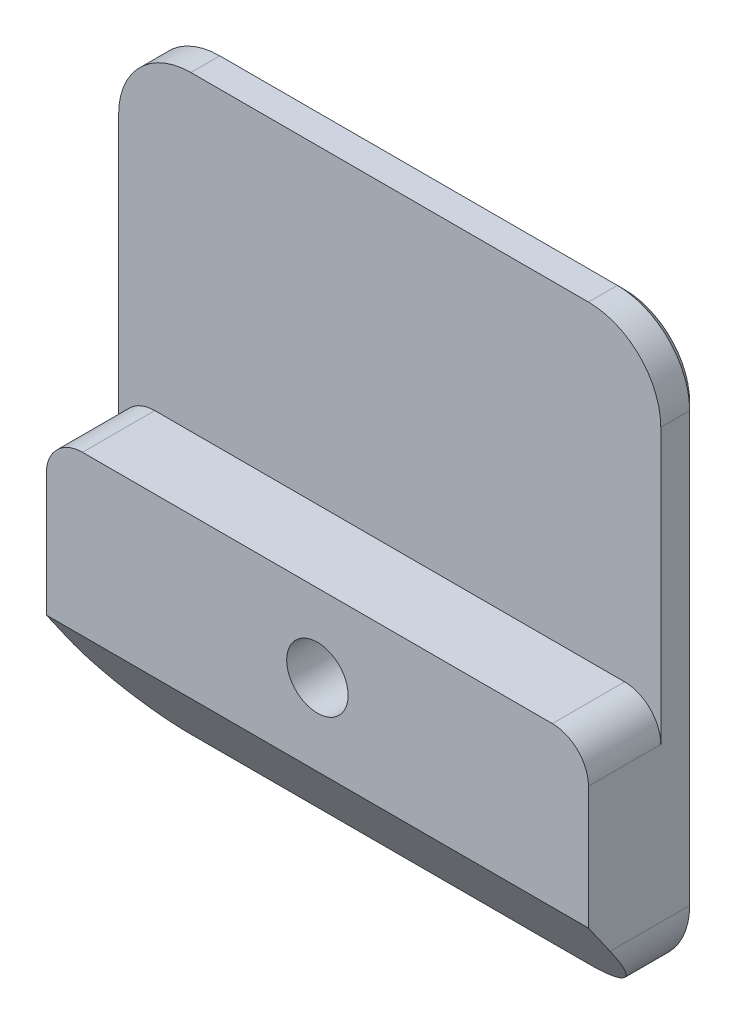
ISO-10303-21;
HEADER;
FILE_DESCRIPTION(('STEP AP214'),'2;1');
FILE_NAME('part.step','',(''),(''),'','','');
FILE_SCHEMA(('AUTOMOTIVE_DESIGN { 1 0 10303 214 1 1 1 1 }'));
ENDSEC;
DATA;
#1=APPLICATION_CONTEXT('core data for automotive mechanical design processes');
#2=APPLICATION_PROTOCOL_DEFINITION('international standard','automotive_design',2000,#1);
#3=PRODUCT_CONTEXT('',#1,'mechanical');
#4=PRODUCT('Part','Part','',(#3));
#5=PRODUCT_RELATED_PRODUCT_CATEGORY('part','',(#4));
#6=PRODUCT_DEFINITION_FORMATION('','',#4);
#7=PRODUCT_DEFINITION_CONTEXT('part definition',#1,'design');
#8=PRODUCT_DEFINITION('design','',#6,#7);
#9=PRODUCT_DEFINITION_SHAPE('','',#8);
#10=(LENGTH_UNIT() NAMED_UNIT(*) SI_UNIT(.MILLI.,.METRE.));
#11=(NAMED_UNIT(*) PLANE_ANGLE_UNIT() SI_UNIT($,.RADIAN.));
#12=(NAMED_UNIT(*) SI_UNIT($,.STERADIAN.) SOLID_ANGLE_UNIT());
#13=UNCERTAINTY_MEASURE_WITH_UNIT(LENGTH_MEASURE(1.E-05),#10,'distance_accuracy_value','');
#14=(GEOMETRIC_REPRESENTATION_CONTEXT(3) GLOBAL_UNCERTAINTY_ASSIGNED_CONTEXT((#13)) GLOBAL_UNIT_ASSIGNED_CONTEXT((#10,
#11,#12)) REPRESENTATION_CONTEXT('',''));
#15=CARTESIAN_POINT('',(0.,0.,0.));
#16=DIRECTION('',(0.,0.,1.));
#17=DIRECTION('',(1.,0.,0.));
#18=AXIS2_PLACEMENT_3D('',#15,#16,#17);
#19=CARTESIAN_POINT('',(127.000000000024,144.499999642365,-120.096120019362));
#20=DIRECTION('',(0.,0.,-1.));
#21=DIRECTION('',(0.,-1.,0.));
#22=AXIS2_PLACEMENT_3D('',#19,#20,#21);
#23=PLANE('',#22);
#24=CARTESIAN_POINT('',(17.5000805501884,-22.4999238370435,-120.096120019362));
#25=DIRECTION('',(0.,0.,-1.));
#26=DIRECTION('',(1.,0.,0.));
#27=AXIS2_PLACEMENT_3D('',#24,#25,#26);
#28=CIRCLE('',#27,1.7);
#29=CARTESIAN_POINT('',(15.8000805501884,-22.4999238370435,-120.096120019362));
#30=VERTEX_POINT('',#29);
#31=EDGE_CURVE('E314',#30,#30,#28,.T.);
#32=ORIENTED_EDGE('',*,*,#31,.T.);
#33=EDGE_LOOP('',(#32));
#34=FACE_BOUND('',#33,.T.);
#35=CARTESIAN_POINT('',(4.5000805501884,-20.1999243138907,-120.096120019362));
#36=DIRECTION('',(0.,0.,-1.));
#37=DIRECTION('',(-0.707106781186547,0.707106781186548,0.));
#38=AXIS2_PLACEMENT_3D('',#35,#36,#37);
#39=CIRCLE('',#38,2.);
#40=CARTESIAN_POINT('',(2.50008055018839,-20.1999243138907,-120.096120019362));
#41=VERTEX_POINT('',#40);
#42=CARTESIAN_POINT('',(4.50008055018838,-18.1999243138907,-120.096120019362));
#43=VERTEX_POINT('',#42);
#44=EDGE_CURVE('E216',#41,#43,#39,.T.);
#45=ORIENTED_EDGE('',*,*,#44,.F.);
#46=DIRECTION('',(0.,1.,0.));
#47=VECTOR('',#46,1.);
#48=CARTESIAN_POINT('',(2.50008055018839,55.8937418891761,-120.096120019362));
#49=LINE('',#48,#47);
#50=CARTESIAN_POINT('',(2.5000805501884,-26.9999238370439,-120.096113854182));
#51=VERTEX_POINT('',#50);
#52=EDGE_CURVE('E222',#51,#41,#49,.T.);
#53=ORIENTED_EDGE('',*,*,#52,.F.);
#54=DIRECTION('',(1.,0.,0.));
#55=VECTOR('',#54,1.);
#56=CARTESIAN_POINT('',(97.2500402751087,-26.9999326418315,-120.096120019362));
#57=LINE('',#56,#55);
#58=CARTESIAN_POINT('',(32.5000805501884,-26.9999238370432,-120.096113854182));
#59=VERTEX_POINT('',#58);
#60=EDGE_CURVE('E220',#51,#59,#57,.T.);
#61=ORIENTED_EDGE('',*,*,#60,.T.);
#62=DIRECTION('',(0.,-1.,0.));
#63=VECTOR('',#62,1.);
#64=CARTESIAN_POINT('',(32.5000805501884,71.7499574538275,-120.096120019362));
#65=LINE('',#64,#63);
#66=CARTESIAN_POINT('',(32.5000805501884,-20.1999243138907,-120.096120019362));
#67=VERTEX_POINT('',#66);
#68=EDGE_CURVE('E205',#67,#59,#65,.T.);
#69=ORIENTED_EDGE('',*,*,#68,.F.);
#70=CARTESIAN_POINT('',(30.5000805501884,-20.1999243138907,-120.096120019362));
#71=DIRECTION('',(0.,0.,-1.));
#72=DIRECTION('',(0.707106781186549,0.707106781186546,0.));
#73=AXIS2_PLACEMENT_3D('',#70,#71,#72);
#74=CIRCLE('',#73,2.);
#75=CARTESIAN_POINT('',(30.5000805501884,-18.1999243138907,-120.096120019362));
#76=VERTEX_POINT('',#75);
#77=EDGE_CURVE('E181',#76,#67,#74,.T.);
#78=ORIENTED_EDGE('',*,*,#77,.F.);
#79=DIRECTION('',(-1.,0.,0.));
#80=VECTOR('',#79,1.);
#81=CARTESIAN_POINT('',(219.500000000024,-18.1999243138907,-120.096120019362));
#82=LINE('',#81,#80);
#83=EDGE_CURVE('E319',#76,#43,#82,.T.);
#84=ORIENTED_EDGE('',*,*,#83,.T.);
#85=EDGE_LOOP('',(#45,#53,#61,#69,#78,#84));
#86=FACE_BOUND('',#85,.T.);
#87=ADVANCED_FACE('F17',(#34,#86),#23,.F.);
#88=CARTESIAN_POINT('',(28.5000805501884,-5.00008473471028,-124.09611364809));
#89=DIRECTION('',(0.,0.,-1.));
#90=DIRECTION('',(0.707106781186548,0.707106781186547,0.));
#91=AXIS2_PLACEMENT_3D('',#88,#89,#90);
#92=CYLINDRICAL_SURFACE('',#91,4.);
#93=CARTESIAN_POINT('',(28.5000805501884,-5.00008473471028,-125.69611364809));
#94=DIRECTION('',(0.,0.,-1.));
#95=DIRECTION('',(0.707106781186548,0.707106781186547,0.));
#96=AXIS2_PLACEMENT_3D('',#93,#94,#95);
#97=CIRCLE('',#96,4.);
#98=CARTESIAN_POINT('',(28.5000805501884,-1.00008473471028,-125.69611364809));
#99=VERTEX_POINT('',#98);
#100=CARTESIAN_POINT('',(32.5000805501884,-5.00008473471028,-125.69611364809));
#101=VERTEX_POINT('',#100);
#102=EDGE_CURVE('E285',#99,#101,#97,.T.);
#103=ORIENTED_EDGE('',*,*,#102,.F.);
#104=DIRECTION('',(0.,0.,1.));
#105=VECTOR('',#104,1.);
#106=CARTESIAN_POINT('',(28.5000805501884,-1.00008473471028,-124.09611364809));
#107=LINE('',#106,#105);
#108=CARTESIAN_POINT('',(28.5000805501884,-1.00008473471028,-124.09611385418));
#109=VERTEX_POINT('',#108);
#110=EDGE_CURVE('E28',#99,#109,#107,.T.);
#111=ORIENTED_EDGE('',*,*,#110,.T.);
#112=CARTESIAN_POINT('',(28.5000805501884,-5.00008473471028,-124.09611385418));
#113=DIRECTION('',(0.,0.,-1.));
#114=DIRECTION('',(0.707106781186548,0.707106781186547,0.));
#115=AXIS2_PLACEMENT_3D('',#112,#113,#114);
#116=CIRCLE('',#115,4.);
#117=CARTESIAN_POINT('',(32.5000805501884,-5.00008473471029,-124.09611385418));
#118=VERTEX_POINT('',#117);
#119=EDGE_CURVE('E11',#109,#118,#116,.T.);
#120=ORIENTED_EDGE('',*,*,#119,.T.);
#121=DIRECTION('',(0.,0.,-1.));
#122=VECTOR('',#121,1.);
#123=CARTESIAN_POINT('',(32.5000805501884,-5.00008473471028,-124.09611364809));
#124=LINE('',#123,#122);
#125=EDGE_CURVE('E291',#118,#101,#124,.T.);
#126=ORIENTED_EDGE('',*,*,#125,.T.);
#127=EDGE_LOOP('',(#103,#111,#120,#126));
#128=FACE_BOUND('',#127,.T.);
#129=ADVANCED_FACE('F534',(#128),#92,.T.);
#130=CARTESIAN_POINT('',(127.000000000024,166.999999999986,-124.09611385418));
#131=DIRECTION('',(0.,0.,-1.));
#132=DIRECTION('',(0.,-1.,0.));
#133=AXIS2_PLACEMENT_3D('',#130,#131,#132);
#134=PLANE('',#133);
#135=DIRECTION('',(0.,-1.,0.));
#136=VECTOR('',#135,1.);
#137=CARTESIAN_POINT('',(32.5000805501884,82.9999576326379,-124.09611385418));
#138=LINE('',#137,#136);
#139=CARTESIAN_POINT('',(32.5000805501884,-20.1999243138907,-124.09611385418));
#140=VERTEX_POINT('',#139);
#141=EDGE_CURVE('E294',#118,#140,#138,.T.);
#142=ORIENTED_EDGE('',*,*,#141,.F.);
#143=ORIENTED_EDGE('',*,*,#119,.F.);
#144=DIRECTION('',(1.,0.,0.));
#145=VECTOR('',#144,1.);
#146=CARTESIAN_POINT('',(64.7500402751065,-1.00008473471027,-124.09611385418));
#147=LINE('',#146,#145);
#148=CARTESIAN_POINT('',(6.5000805501884,-1.00008473471028,-124.09611385418));
#149=VERTEX_POINT('',#148);
#150=EDGE_CURVE('E373',#149,#109,#147,.T.);
#151=ORIENTED_EDGE('',*,*,#150,.F.);
#152=CARTESIAN_POINT('',(6.5000805501884,-5.00008473471029,-124.09611385418));
#153=DIRECTION('',(0.,0.,-1.));
#154=DIRECTION('',(-0.707106781186548,0.707106781186548,0.));
#155=AXIS2_PLACEMENT_3D('',#152,#153,#154);
#156=CIRCLE('',#155,4.);
#157=CARTESIAN_POINT('',(2.50008055018839,-5.00008473471029,-124.09611385418));
#158=VERTEX_POINT('',#157);
#159=EDGE_CURVE('E318',#158,#149,#156,.T.);
#160=ORIENTED_EDGE('',*,*,#159,.F.);
#161=DIRECTION('',(0.,1.,0.));
#162=VECTOR('',#161,1.);
#163=CARTESIAN_POINT('',(2.50008055018839,67.1437420679865,-124.09611385418));
#164=LINE('',#163,#162);
#165=CARTESIAN_POINT('',(2.5000805501884,-20.1999243138907,-124.09611385418));
#166=VERTEX_POINT('',#165);
#167=EDGE_CURVE('E278',#166,#158,#164,.T.);
#168=ORIENTED_EDGE('',*,*,#167,.F.);
#169=CARTESIAN_POINT('',(4.5000805501884,-20.1999243138907,-124.09611385418));
#170=DIRECTION('',(0.,0.,1.));
#171=DIRECTION('',(-0.707106781186547,0.707106781186548,0.));
#172=AXIS2_PLACEMENT_3D('',#169,#170,#171);
#173=CIRCLE('',#172,2.);
#174=CARTESIAN_POINT('',(4.50008055018838,-18.1999243138907,-124.09611385418));
#175=VERTEX_POINT('',#174);
#176=EDGE_CURVE('E324',#175,#166,#173,.T.);
#177=ORIENTED_EDGE('',*,*,#176,.F.);
#178=DIRECTION('',(-1.,0.,0.));
#179=VECTOR('',#178,1.);
#180=CARTESIAN_POINT('',(219.500000000024,-18.1999243138907,-124.09611385418));
#181=LINE('',#180,#179);
#182=CARTESIAN_POINT('',(30.5000805501884,-18.1999243138907,-124.09611385418));
#183=VERTEX_POINT('',#182);
#184=EDGE_CURVE('E315',#183,#175,#181,.T.);
#185=ORIENTED_EDGE('',*,*,#184,.F.);
#186=CARTESIAN_POINT('',(30.5000805501884,-20.1999243138907,-124.09611385418));
#187=DIRECTION('',(0.,0.,1.));
#188=DIRECTION('',(0.707106781186549,0.707106781186546,0.));
#189=AXIS2_PLACEMENT_3D('',#186,#187,#188);
#190=CIRCLE('',#189,2.);
#191=EDGE_CURVE('E170',#140,#183,#190,.T.);
#192=ORIENTED_EDGE('',*,*,#191,.F.);
#193=EDGE_LOOP('',(#142,#143,#151,#160,#168,#177,#185,#192));
#194=FACE_BOUND('',#193,.T.);
#195=ADVANCED_FACE('F526',(#194),#134,.F.);
#196=CARTESIAN_POINT('',(2.5000805501884,-1.00008473471029,-124.09611364809));
#197=DIRECTION('',(0.,1.,0.));
#198=DIRECTION('',(1.,0.,0.));
#199=AXIS2_PLACEMENT_3D('',#196,#197,#198);
#200=PLANE('',#199);
#201=DIRECTION('',(1.,0.,0.));
#202=VECTOR('',#201,1.);
#203=CARTESIAN_POINT('',(64.7500402751065,-1.00008473471027,-125.69611364809));
#204=LINE('',#203,#202);
#205=CARTESIAN_POINT('',(6.5000805501884,-1.00008473471029,-125.69611364809));
#206=VERTEX_POINT('',#205);
#207=EDGE_CURVE('E303',#206,#99,#204,.T.);
#208=ORIENTED_EDGE('',*,*,#207,.F.);
#209=DIRECTION('',(0.,0.,-1.));
#210=VECTOR('',#209,1.);
#211=CARTESIAN_POINT('',(6.5000805501884,-1.00008473471029,-124.09611364809));
#212=LINE('',#211,#210);
#213=EDGE_CURVE('E426',#149,#206,#212,.T.);
#214=ORIENTED_EDGE('',*,*,#213,.F.);
#215=ORIENTED_EDGE('',*,*,#150,.T.);
#216=ORIENTED_EDGE('',*,*,#110,.F.);
#217=EDGE_LOOP('',(#208,#214,#215,#216));
#218=FACE_BOUND('',#217,.T.);
#219=ADVANCED_FACE('F483',(#218),#200,.T.);
#220=CARTESIAN_POINT('',(6.5000805501884,-5.00008473471029,-124.09611364809));
#221=DIRECTION('',(0.,0.,-1.));
#222=DIRECTION('',(-0.707106781186548,0.707106781186548,0.));
#223=AXIS2_PLACEMENT_3D('',#220,#221,#222);
#224=CYLINDRICAL_SURFACE('',#223,4.);
#225=CARTESIAN_POINT('',(6.5000805501884,-5.00008473471029,-125.69611364809));
#226=DIRECTION('',(0.,0.,-1.));
#227=DIRECTION('',(-0.707106781186548,0.707106781186548,0.));
#228=AXIS2_PLACEMENT_3D('',#225,#226,#227);
#229=CIRCLE('',#228,4.);
#230=CARTESIAN_POINT('',(2.5000805501884,-5.00008473471029,-125.69611364809));
#231=VERTEX_POINT('',#230);
#232=EDGE_CURVE('E302',#231,#206,#229,.T.);
#233=ORIENTED_EDGE('',*,*,#232,.F.);
#234=DIRECTION('',(0.,0.,1.));
#235=VECTOR('',#234,1.);
#236=CARTESIAN_POINT('',(2.5000805501884,-5.00008473471029,-124.09611364809));
#237=LINE('',#236,#235);
#238=EDGE_CURVE('E242',#231,#158,#237,.T.);
#239=ORIENTED_EDGE('',*,*,#238,.T.);
#240=ORIENTED_EDGE('',*,*,#159,.T.);
#241=ORIENTED_EDGE('',*,*,#213,.T.);
#242=EDGE_LOOP('',(#233,#239,#240,#241));
#243=FACE_BOUND('',#242,.T.);
#244=ADVANCED_FACE('F555',(#243),#224,.T.);
#245=CARTESIAN_POINT('',(312.000000000024,-18.1999243138907,-120.09611385418));
#246=DIRECTION('',(0.,-1.,0.));
#247=DIRECTION('',(0.,0.,-1.));
#248=AXIS2_PLACEMENT_3D('',#245,#246,#247);
#249=PLANE('',#248);
#250=DIRECTION('',(0.,0.,-1.));
#251=VECTOR('',#250,1.);
#252=CARTESIAN_POINT('',(4.5000805501884,-18.1999243138907,-122.096113751135));
#253=LINE('',#252,#251);
#254=EDGE_CURVE('E320',#43,#175,#253,.T.);
#255=ORIENTED_EDGE('',*,*,#254,.F.);
#256=ORIENTED_EDGE('',*,*,#83,.F.);
#257=DIRECTION('',(0.,0.,1.));
#258=VECTOR('',#257,1.);
#259=CARTESIAN_POINT('',(30.5000805501884,-18.1999243138907,-122.096113751135));
#260=LINE('',#259,#258);
#261=EDGE_CURVE('E297',#183,#76,#260,.T.);
#262=ORIENTED_EDGE('',*,*,#261,.F.);
#263=ORIENTED_EDGE('',*,*,#184,.T.);
#264=EDGE_LOOP('',(#255,#256,#262,#263));
#265=FACE_BOUND('',#264,.T.);
#266=ADVANCED_FACE('F530',(#265),#249,.F.);
#267=CARTESIAN_POINT('',(30.5000805501884,-20.1999243138907,-122.096113751135));
#268=DIRECTION('',(0.,0.,-1.));
#269=DIRECTION('',(0.707106781186549,0.707106781186546,0.));
#270=AXIS2_PLACEMENT_3D('',#267,#268,#269);
#271=CYLINDRICAL_SURFACE('',#270,2.);
#272=ORIENTED_EDGE('',*,*,#77,.T.);
#273=DIRECTION('',(0.,0.,-1.));
#274=VECTOR('',#273,1.);
#275=CARTESIAN_POINT('',(32.5000805501884,-20.1999243138907,-122.096113751135));
#276=LINE('',#275,#274);
#277=EDGE_CURVE('E213',#67,#140,#276,.T.);
#278=ORIENTED_EDGE('',*,*,#277,.T.);
#279=ORIENTED_EDGE('',*,*,#191,.T.);
#280=ORIENTED_EDGE('',*,*,#261,.T.);
#281=EDGE_LOOP('',(#272,#278,#279,#280));
#282=FACE_BOUND('',#281,.T.);
#283=ADVANCED_FACE('F531',(#282),#271,.T.);
#284=CARTESIAN_POINT('',(4.5000805501884,-20.1999243138907,-122.096113751135));
#285=DIRECTION('',(0.,0.,1.));
#286=DIRECTION('',(-0.707106781186547,0.707106781186548,0.));
#287=AXIS2_PLACEMENT_3D('',#284,#285,#286);
#288=CYLINDRICAL_SURFACE('',#287,2.);
#289=ORIENTED_EDGE('',*,*,#44,.T.);
#290=ORIENTED_EDGE('',*,*,#254,.T.);
#291=ORIENTED_EDGE('',*,*,#176,.T.);
#292=DIRECTION('',(0.,0.,1.));
#293=VECTOR('',#292,1.);
#294=CARTESIAN_POINT('',(2.5000805501884,-20.1999243138907,-122.096113751135));
#295=LINE('',#294,#293);
#296=EDGE_CURVE('E251',#166,#41,#295,.T.);
#297=ORIENTED_EDGE('',*,*,#296,.T.);
#298=EDGE_LOOP('',(#289,#290,#291,#297));
#299=FACE_BOUND('',#298,.T.);
#300=ADVANCED_FACE('F561',(#299),#288,.T.);
#301=CARTESIAN_POINT('',(79.7500402751087,-32.2125158640111,-125.59611364809));
#302=DIRECTION('',(0.,-0.707106781186538,-0.707106781186557));
#303=DIRECTION('',(0.,-0.707106781186557,0.707106781186538));
#304=AXIS2_PLACEMENT_3D('',#301,#302,#303);
#305=PLANE('',#304);
#306=CARTESIAN_POINT('',(4.51010567597524,-31.712515864013,-126.09611364809));
#307=CARTESIAN_POINT('',(4.45152773779655,-31.9067969059444,-125.901832606158));
#308=CARTESIAN_POINT('',(4.39294979961794,-32.112515864013,-125.69611364809));
#309=(BOUNDED_CURVE() B_SPLINE_CURVE(2,(#306,#307,#308),.UNSPECIFIED.,.F.,
.F.) B_SPLINE_CURVE_WITH_KNOTS((3,3),(0.,0.059995084388951),
.UNSPECIFIED.) CURVE() GEOMETRIC_REPRESENTATION_ITEM() RATIONAL_B_SPLINE_CURVE((1.,1.,1.)) REPRESENTATION_ITEM(''));
#310=CARTESIAN_POINT('',(4.51010567597523,-31.712515864013,-126.09611364809));
#311=VERTEX_POINT('',#310);
#312=CARTESIAN_POINT('',(4.39294979961794,-32.112515864013,-125.69611364809));
#313=VERTEX_POINT('',#312);
#314=EDGE_CURVE('E349',#311,#313,#309,.T.);
#315=ORIENTED_EDGE('',*,*,#314,.F.);
#316=DIRECTION('',(1.,0.,0.));
#317=VECTOR('',#316,1.);
#318=CARTESIAN_POINT('',(79.7500402751087,-31.7125158640111,-126.09611364809));
#319=LINE('',#318,#317);
#320=CARTESIAN_POINT('',(30.4900554244017,-31.7125158640123,-126.09611364809));
#321=VERTEX_POINT('',#320);
#322=EDGE_CURVE('E156',#311,#321,#319,.T.);
#323=ORIENTED_EDGE('',*,*,#322,.T.);
#324=CARTESIAN_POINT('',(30.607211300759,-32.1125158640124,-125.69611364809));
#325=CARTESIAN_POINT('',(30.5486333625804,-31.9067969059438,-125.901832606158));
#326=CARTESIAN_POINT('',(30.4900554244017,-31.7125158640123,-126.09611364809));
#327=(BOUNDED_CURVE() B_SPLINE_CURVE(2,(#324,#325,#326),.UNSPECIFIED.,.F.,
.F.) B_SPLINE_CURVE_WITH_KNOTS((3,3),(0.0842053107797994,0.144200395168736),
.UNSPECIFIED.) CURVE() GEOMETRIC_REPRESENTATION_ITEM() RATIONAL_B_SPLINE_CURVE((1.,1.,1.)) REPRESENTATION_ITEM(''));
#328=CARTESIAN_POINT('',(30.607211300759,-32.1125158640124,-125.69611364809));
#329=VERTEX_POINT('',#328);
#330=EDGE_CURVE('E369',#329,#321,#327,.T.);
#331=ORIENTED_EDGE('',*,*,#330,.F.);
#332=CARTESIAN_POINT('',(28.5000805501884,-28.7125158640124,-129.09611364809));
#333=DIRECTION('',(0.,0.707106781186538,0.707106781186557));
#334=DIRECTION('',(0.,-0.707106781186557,0.707106781186538));
#335=AXIS2_PLACEMENT_3D('',#332,#333,#334);
#336=ELLIPSE('',#335,5.65685424949231,4.);
#337=CARTESIAN_POINT('',(28.5000805501885,-32.7125158640124,-125.09611364809));
#338=VERTEX_POINT('',#337);
#339=EDGE_CURVE('E144',#338,#329,#336,.T.);
#340=ORIENTED_EDGE('',*,*,#339,.F.);
#341=DIRECTION('',(-1.,0.,0.));
#342=VECTOR('',#341,1.);
#343=CARTESIAN_POINT('',(79.7500402751087,-32.7125158640111,-125.09611364809));
#344=LINE('',#343,#342);
#345=CARTESIAN_POINT('',(6.50008055018851,-32.712515864013,-125.09611364809));
#346=VERTEX_POINT('',#345);
#347=EDGE_CURVE('E226',#338,#346,#344,.T.);
#348=ORIENTED_EDGE('',*,*,#347,.T.);
#349=CARTESIAN_POINT('',(6.5000805501884,-28.712515864013,-129.09611364809));
#350=DIRECTION('',(0.,0.707106781186538,0.707106781186557));
#351=DIRECTION('',(0.,-0.707106781186557,0.707106781186538));
#352=AXIS2_PLACEMENT_3D('',#349,#350,#351);
#353=ELLIPSE('',#352,5.6568542494923,4.);
#354=EDGE_CURVE('E390',#313,#346,#353,.T.);
#355=ORIENTED_EDGE('',*,*,#354,.F.);
#356=EDGE_LOOP('',(#315,#323,#331,#340,#348,#355));
#357=FACE_BOUND('',#356,.T.);
#358=ADVANCED_FACE('F499',(#357),#305,.T.);
#359=CARTESIAN_POINT('',(32.5000805501884,-1.00008473471028,-124.09611364809));
#360=DIRECTION('',(1.,0.,0.));
#361=DIRECTION('',(0.,1.,0.));
#362=AXIS2_PLACEMENT_3D('',#359,#360,#361);
#363=PLANE('',#362);
#364=DIRECTION('',(0.,-1.,0.));
#365=VECTOR('',#364,1.);
#366=CARTESIAN_POINT('',(32.5000805501884,71.7499574538275,-125.69611364809));
#367=LINE('',#366,#365);
#368=CARTESIAN_POINT('',(32.5000805501884,-28.7125158640124,-125.69611364809));
#369=VERTEX_POINT('',#368);
#370=EDGE_CURVE('E325',#101,#369,#367,.T.);
#371=ORIENTED_EDGE('',*,*,#370,.F.);
#372=ORIENTED_EDGE('',*,*,#125,.F.);
#373=ORIENTED_EDGE('',*,*,#141,.T.);
#374=ORIENTED_EDGE('',*,*,#277,.F.);
#375=ORIENTED_EDGE('',*,*,#68,.T.);
#376=DIRECTION('',(0.,-0.819152044289135,-0.573576436350842));
#377=VECTOR('',#376,1.);
#378=CARTESIAN_POINT('',(32.5000805501884,-22.0728354732551,-116.646129440434));
#379=LINE('',#378,#377);
#380=CARTESIAN_POINT('',(32.5000805501884,-28.7125158640124,-121.295283701343));
#381=VERTEX_POINT('',#380);
#382=EDGE_CURVE('E210',#59,#381,#379,.T.);
#383=ORIENTED_EDGE('',*,*,#382,.T.);
#384=DIRECTION('',(0.,0.,1.));
#385=VECTOR('',#384,1.);
#386=CARTESIAN_POINT('',(32.5000805501884,-28.7125158640124,-124.09611364809));
#387=LINE('',#386,#385);
#388=EDGE_CURVE('E344',#369,#381,#387,.T.);
#389=ORIENTED_EDGE('',*,*,#388,.F.);
#390=EDGE_LOOP('',(#371,#372,#373,#374,#375,#383,#389));
#391=FACE_BOUND('',#390,.T.);
#392=ADVANCED_FACE('F208',(#391),#363,.T.);
#393=CARTESIAN_POINT('',(32.5000805501884,-32.7125158640123,-124.09611364809));
#394=DIRECTION('',(0.,-1.,0.));
#395=DIRECTION('',(0.,0.,-1.));
#396=AXIS2_PLACEMENT_3D('',#393,#394,#395);
#397=PLANE('',#396);
#398=DIRECTION('',(0.,0.,1.));
#399=VECTOR('',#398,1.);
#400=CARTESIAN_POINT('',(6.5000805501885,-32.712515864013,-124.09611364809));
#401=LINE('',#400,#399);
#402=CARTESIAN_POINT('',(6.5000805501885,-32.712515864013,-124.09611385418));
#403=VERTEX_POINT('',#402);
#404=EDGE_CURVE('E270',#346,#403,#401,.T.);
#405=ORIENTED_EDGE('',*,*,#404,.F.);
#406=ORIENTED_EDGE('',*,*,#347,.F.);
#407=DIRECTION('',(0.,0.,-1.));
#408=VECTOR('',#407,1.);
#409=CARTESIAN_POINT('',(28.5000805501885,-32.7125158640124,-124.09611364809));
#410=LINE('',#409,#408);
#411=CARTESIAN_POINT('',(28.5000805501885,-32.7125158640124,-124.09611385418));
#412=VERTEX_POINT('',#411);
#413=EDGE_CURVE('E359',#412,#338,#410,.T.);
#414=ORIENTED_EDGE('',*,*,#413,.F.);
#415=DIRECTION('',(-1.,0.,0.));
#416=VECTOR('',#415,1.);
#417=CARTESIAN_POINT('',(50.0000805501885,-32.7125158640119,-124.09611385418));
#418=LINE('',#417,#416);
#419=EDGE_CURVE('E235',#412,#403,#418,.T.);
#420=ORIENTED_EDGE('',*,*,#419,.T.);
#421=EDGE_LOOP('',(#405,#406,#414,#420));
#422=FACE_BOUND('',#421,.T.);
#423=ADVANCED_FACE('F506',(#422),#397,.T.);
#424=CARTESIAN_POINT('',(67.5000805501887,-32.7125158640116,-124.09611385418));
#425=DIRECTION('',(0.,-0.573576436350842,0.819152044289135));
#426=DIRECTION('',(-1.,0.,0.));
#427=AXIS2_PLACEMENT_3D('',#424,#425,#426);
#428=PLANE('',#427);
#429=CARTESIAN_POINT('',(6.5000805501884,-28.712515864013,-121.295283701343));
#430=DIRECTION('',(0.,0.573576436350842,-0.819152044289135));
#431=DIRECTION('',(0.,-0.819152044289135,-0.573576436350842));
#432=AXIS2_PLACEMENT_3D('',#429,#430,#431);
#433=ELLIPSE('',#432,4.88309835504497,4.);
#434=CARTESIAN_POINT('',(2.5000805501884,-28.712515864013,-121.295283701343));
#435=VERTEX_POINT('',#434);
#436=EDGE_CURVE('E261',#403,#435,#433,.T.);
#437=ORIENTED_EDGE('',*,*,#436,.F.);
#438=ORIENTED_EDGE('',*,*,#419,.F.);
#439=CARTESIAN_POINT('',(28.5000805501884,-28.7125158640124,-121.295283701343));
#440=DIRECTION('',(0.,0.573576436350842,-0.819152044289135));
#441=DIRECTION('',(0.,-0.819152044289135,-0.573576436350842));
#442=AXIS2_PLACEMENT_3D('',#439,#440,#441);
#443=ELLIPSE('',#442,4.88309835504497,4.);
#444=EDGE_CURVE('E232',#381,#412,#443,.T.);
#445=ORIENTED_EDGE('',*,*,#444,.F.);
#446=ORIENTED_EDGE('',*,*,#382,.F.);
#447=ORIENTED_EDGE('',*,*,#60,.F.);
#448=DIRECTION('',(0.,0.819152044289135,0.573576436350842));
#449=VECTOR('',#448,1.);
#450=CARTESIAN_POINT('',(2.5000805501884,-32.7125158155971,-124.096113820279));
#451=LINE('',#450,#449);
#452=EDGE_CURVE('E252',#435,#51,#451,.T.);
#453=ORIENTED_EDGE('',*,*,#452,.F.);
#454=EDGE_LOOP('',(#437,#438,#445,#446,#447,#453));
#455=FACE_BOUND('',#454,.T.);
#456=ADVANCED_FACE('F229',(#455),#428,.T.);
#457=CARTESIAN_POINT('',(2.5000805501884,-32.7125158640131,-124.09611364809));
#458=DIRECTION('',(-1.,0.,0.));
#459=DIRECTION('',(0.,0.,1.));
#460=AXIS2_PLACEMENT_3D('',#457,#458,#459);
#461=PLANE('',#460);
#462=DIRECTION('',(0.,1.,0.));
#463=VECTOR('',#462,1.);
#464=CARTESIAN_POINT('',(2.5000805501884,55.8937418891761,-125.69611364809));
#465=LINE('',#464,#463);
#466=CARTESIAN_POINT('',(2.5000805501884,-28.712515864013,-125.69611364809));
#467=VERTEX_POINT('',#466);
#468=EDGE_CURVE('E358',#467,#231,#465,.T.);
#469=ORIENTED_EDGE('',*,*,#468,.F.);
#470=DIRECTION('',(0.,0.,-1.));
#471=VECTOR('',#470,1.);
#472=CARTESIAN_POINT('',(2.5000805501884,-28.712515864013,-124.09611364809));
#473=LINE('',#472,#471);
#474=EDGE_CURVE('E255',#435,#467,#473,.T.);
#475=ORIENTED_EDGE('',*,*,#474,.F.);
#476=ORIENTED_EDGE('',*,*,#452,.T.);
#477=ORIENTED_EDGE('',*,*,#52,.T.);
#478=ORIENTED_EDGE('',*,*,#296,.F.);
#479=ORIENTED_EDGE('',*,*,#167,.T.);
#480=ORIENTED_EDGE('',*,*,#238,.F.);
#481=EDGE_LOOP('',(#469,#475,#476,#477,#478,#479,#480));
#482=FACE_BOUND('',#481,.T.);
#483=ADVANCED_FACE('F569',(#482),#461,.T.);
#484=CARTESIAN_POINT('',(6.5000805501884,-28.712515864013,-124.09611364809));
#485=DIRECTION('',(0.,0.,-1.));
#486=DIRECTION('',(-0.707106781186538,-0.707106781186557,0.));
#487=AXIS2_PLACEMENT_3D('',#484,#485,#486);
#488=CYLINDRICAL_SURFACE('',#487,4.);
#489=CARTESIAN_POINT('',(6.5000805501884,-28.712515864013,-125.69611364809));
#490=DIRECTION('',(0.,0.,-1.));
#491=DIRECTION('',(-0.707106781186538,-0.707106781186557,0.));
#492=AXIS2_PLACEMENT_3D('',#489,#490,#491);
#493=CIRCLE('',#492,4.);
#494=EDGE_CURVE('E345',#313,#467,#493,.T.);
#495=ORIENTED_EDGE('',*,*,#494,.F.);
#496=ORIENTED_EDGE('',*,*,#354,.T.);
#497=ORIENTED_EDGE('',*,*,#404,.T.);
#498=ORIENTED_EDGE('',*,*,#436,.T.);
#499=ORIENTED_EDGE('',*,*,#474,.T.);
#500=EDGE_LOOP('',(#495,#496,#497,#498,#499));
#501=FACE_BOUND('',#500,.T.);
#502=ADVANCED_FACE('F586',(#501),#488,.T.);
#503=CARTESIAN_POINT('',(17.5000805501884,-22.4999238370435,-126.09611364809));
#504=DIRECTION('',(0.,0.,1.));
#505=DIRECTION('',(1.,0.,0.));
#506=AXIS2_PLACEMENT_3D('',#503,#504,#505);
#507=CYLINDRICAL_SURFACE('',#506,3.);
#508=CARTESIAN_POINT('',(17.5000805501884,-22.4999238370435,-126.09611364809));
#509=DIRECTION('',(0.,0.,1.));
#510=DIRECTION('',(1.,0.,0.));
#511=AXIS2_PLACEMENT_3D('',#508,#509,#510);
#512=CIRCLE('',#511,3.);
#513=CARTESIAN_POINT('',(14.5000805501884,-22.4999238370435,-126.09611364809));
#514=VERTEX_POINT('',#513);
#515=EDGE_CURVE('E340',#514,#514,#512,.T.);
#516=ORIENTED_EDGE('',*,*,#515,.F.);
#517=DIRECTION('',(0.,0.,1.));
#518=VECTOR('',#517,1.);
#519=CARTESIAN_POINT('',(14.5000805501884,-22.4999238370435,-126.09611364809));
#520=LINE('',#519,#518);
#521=CARTESIAN_POINT('',(14.5000805501884,-22.4999238370435,-123.89611364809));
#522=VERTEX_POINT('',#521);
#523=EDGE_CURVE('E313',#514,#522,#520,.T.);
#524=ORIENTED_EDGE('',*,*,#523,.T.);
#525=CARTESIAN_POINT('',(17.5000805501884,-22.4999238370435,-123.89611364809));
#526=DIRECTION('',(0.,0.,1.));
#527=DIRECTION('',(1.,0.,0.));
#528=AXIS2_PLACEMENT_3D('',#525,#526,#527);
#529=CIRCLE('',#528,3.);
#530=EDGE_CURVE('E309',#522,#522,#529,.T.);
#531=ORIENTED_EDGE('',*,*,#530,.T.);
#532=ORIENTED_EDGE('',*,*,#523,.F.);
#533=EDGE_LOOP('',(#516,#524,#531,#532));
#534=FACE_BOUND('',#533,.T.);
#535=ADVANCED_FACE('F591',(#534),#507,.F.);
#536=CARTESIAN_POINT('',(17.5000805501884,-16.3563002993617,-123.89611364809));
#537=DIRECTION('',(0.,0.,-1.));
#538=DIRECTION('',(0.,-1.,0.));
#539=AXIS2_PLACEMENT_3D('',#536,#537,#538);
#540=PLANE('',#539);
#541=CARTESIAN_POINT('',(17.5000805501884,-22.4999238370435,-123.89611364809));
#542=DIRECTION('',(0.,0.,-1.));
#543=DIRECTION('',(1.,0.,0.));
#544=AXIS2_PLACEMENT_3D('',#541,#542,#543);
#545=CIRCLE('',#544,2.9);
#546=CARTESIAN_POINT('',(14.6000805501884,-22.4999238370435,-123.89611364809));
#547=VERTEX_POINT('',#546);
#548=EDGE_CURVE('E417',#547,#547,#545,.T.);
#549=ORIENTED_EDGE('',*,*,#548,.F.);
#550=EDGE_LOOP('',(#549));
#551=FACE_BOUND('',#550,.T.);
#552=ORIENTED_EDGE('',*,*,#530,.F.);
#553=EDGE_LOOP('',(#552));
#554=FACE_BOUND('',#553,.T.);
#555=ADVANCED_FACE('F565',(#551,#554),#540,.T.);
#556=CARTESIAN_POINT('',(17.5000805501884,-22.4999238370435,-124.09611364809));
#557=DIRECTION('',(0.,0.,-1.));
#558=DIRECTION('',(1.,0.,0.));
#559=AXIS2_PLACEMENT_3D('',#556,#557,#558);
#560=CYLINDRICAL_SURFACE('',#559,1.7);
#561=CARTESIAN_POINT('',(17.5000805501884,-22.4999238370435,-122.69611364809));
#562=DIRECTION('',(0.,0.,1.));
#563=DIRECTION('',(1.,0.,0.));
#564=AXIS2_PLACEMENT_3D('',#561,#562,#563);
#565=CIRCLE('',#564,1.7);
#566=CARTESIAN_POINT('',(15.8000805501884,-22.4999238370435,-122.69611364809));
#567=VERTEX_POINT('',#566);
#568=EDGE_CURVE('E279',#567,#567,#565,.T.);
#569=ORIENTED_EDGE('',*,*,#568,.F.);
#570=DIRECTION('',(0.,0.,1.));
#571=VECTOR('',#570,1.);
#572=CARTESIAN_POINT('',(15.8000805501884,-22.4999238370435,-124.09611364809));
#573=LINE('',#572,#571);
#574=EDGE_CURVE('E283',#567,#30,#573,.T.);
#575=ORIENTED_EDGE('',*,*,#574,.T.);
#576=ORIENTED_EDGE('',*,*,#31,.F.);
#577=ORIENTED_EDGE('',*,*,#574,.F.);
#578=EDGE_LOOP('',(#569,#575,#576,#577));
#579=FACE_BOUND('',#578,.T.);
#580=ADVANCED_FACE('F562',(#579),#560,.F.);
#581=CARTESIAN_POINT('',(17.5000805501884,-22.4999238370435,-123.29611364809));
#582=DIRECTION('',(0.,0.,-1.));
#583=DIRECTION('',(1.,0.,0.));
#584=AXIS2_PLACEMENT_3D('',#581,#582,#583);
#585=CONICAL_SURFACE('',#584,2.3,0.785398163397445);
#586=ORIENTED_EDGE('',*,*,#548,.T.);
#587=DIRECTION('',(0.707106781186545,0.,0.70710678118655));
#588=VECTOR('',#587,1.);
#589=CARTESIAN_POINT('',(15.2000805501884,-22.4999238370435,-123.29611364809));
#590=LINE('',#589,#588);
#591=EDGE_CURVE('E284',#547,#567,#590,.T.);
#592=ORIENTED_EDGE('',*,*,#591,.T.);
#593=ORIENTED_EDGE('',*,*,#568,.T.);
#594=ORIENTED_EDGE('',*,*,#591,.F.);
#595=EDGE_LOOP('',(#586,#592,#593,#594));
#596=FACE_BOUND('',#595,.T.);
#597=ADVANCED_FACE('F547',(#596),#585,.F.);
#598=CARTESIAN_POINT('',(28.5000805501884,-28.7125158640124,-124.09611364809));
#599=DIRECTION('',(0.,0.,-1.));
#600=DIRECTION('',(0.707106781186556,-0.707106781186539,0.));
#601=AXIS2_PLACEMENT_3D('',#598,#599,#600);
#602=CYLINDRICAL_SURFACE('',#601,4.);
#603=CARTESIAN_POINT('',(28.5000805501884,-28.7125158640124,-125.69611364809));
#604=DIRECTION('',(0.,0.,-1.));
#605=DIRECTION('',(0.707106781186556,-0.707106781186539,0.));
#606=AXIS2_PLACEMENT_3D('',#603,#604,#605);
#607=CIRCLE('',#606,4.);
#608=EDGE_CURVE('E380',#369,#329,#607,.T.);
#609=ORIENTED_EDGE('',*,*,#608,.F.);
#610=ORIENTED_EDGE('',*,*,#388,.T.);
#611=ORIENTED_EDGE('',*,*,#444,.T.);
#612=ORIENTED_EDGE('',*,*,#413,.T.);
#613=ORIENTED_EDGE('',*,*,#339,.T.);
#614=EDGE_LOOP('',(#609,#610,#611,#612,#613));
#615=FACE_BOUND('',#614,.T.);
#616=ADVANCED_FACE('F504',(#615),#602,.T.);
#617=CARTESIAN_POINT('',(127.000000000024,144.499999642365,-126.09611364809));
#618=DIRECTION('',(0.,0.,-1.));
#619=DIRECTION('',(0.,-1.,0.));
#620=AXIS2_PLACEMENT_3D('',#617,#618,#619);
#621=PLANE('',#620);
#622=ORIENTED_EDGE('',*,*,#515,.T.);
#623=EDGE_LOOP('',(#622));
#624=FACE_BOUND('',#623,.T.);
#625=CARTESIAN_POINT('',(6.5000805501884,-28.712515864013,-126.09611364809));
#626=DIRECTION('',(0.,0.,1.));
#627=DIRECTION('',(-0.707106781186538,-0.707106781186557,0.));
#628=AXIS2_PLACEMENT_3D('',#625,#626,#627);
#629=CIRCLE('',#628,3.6);
#630=CARTESIAN_POINT('',(2.9000805501884,-28.712515864013,-126.09611364809));
#631=VERTEX_POINT('',#630);
#632=EDGE_CURVE('E348',#631,#311,#629,.T.);
#633=ORIENTED_EDGE('',*,*,#632,.F.);
#634=DIRECTION('',(0.,-1.,0.));
#635=VECTOR('',#634,1.);
#636=CARTESIAN_POINT('',(2.9000805501884,55.8937418891761,-126.09611364809));
#637=LINE('',#636,#635);
#638=CARTESIAN_POINT('',(2.9000805501884,-5.00008473471029,-126.09611364809));
#639=VERTEX_POINT('',#638);
#640=EDGE_CURVE('E384',#639,#631,#637,.T.);
#641=ORIENTED_EDGE('',*,*,#640,.F.);
#642=CARTESIAN_POINT('',(6.5000805501884,-5.00008473471029,-126.09611364809));
#643=DIRECTION('',(0.,0.,1.));
#644=DIRECTION('',(-0.707106781186548,0.707106781186548,0.));
#645=AXIS2_PLACEMENT_3D('',#642,#643,#644);
#646=CIRCLE('',#645,3.6);
#647=CARTESIAN_POINT('',(6.5000805501884,-1.40008473471029,-126.09611364809));
#648=VERTEX_POINT('',#647);
#649=EDGE_CURVE('E389',#648,#639,#646,.T.);
#650=ORIENTED_EDGE('',*,*,#649,.F.);
#651=DIRECTION('',(-1.,0.,0.));
#652=VECTOR('',#651,1.);
#653=CARTESIAN_POINT('',(64.7500402751065,-1.40008473471028,-126.09611364809));
#654=LINE('',#653,#652);
#655=CARTESIAN_POINT('',(28.5000805501884,-1.40008473471028,-126.09611364809));
#656=VERTEX_POINT('',#655);
#657=EDGE_CURVE('E308',#656,#648,#654,.T.);
#658=ORIENTED_EDGE('',*,*,#657,.F.);
#659=CARTESIAN_POINT('',(28.5000805501884,-5.00008473471028,-126.09611364809));
#660=DIRECTION('',(0.,0.,1.));
#661=DIRECTION('',(0.707106781186548,0.707106781186547,0.));
#662=AXIS2_PLACEMENT_3D('',#659,#660,#661);
#663=CIRCLE('',#662,3.6);
#664=CARTESIAN_POINT('',(32.1000805501884,-5.00008473471029,-126.09611364809));
#665=VERTEX_POINT('',#664);
#666=EDGE_CURVE('E289',#665,#656,#663,.T.);
#667=ORIENTED_EDGE('',*,*,#666,.F.);
#668=DIRECTION('',(0.,1.,0.));
#669=VECTOR('',#668,1.);
#670=CARTESIAN_POINT('',(32.1000805501884,71.7499574538275,-126.09611364809));
#671=LINE('',#670,#669);
#672=CARTESIAN_POINT('',(32.1000805501884,-28.7125158640124,-126.09611364809));
#673=VERTEX_POINT('',#672);
#674=EDGE_CURVE('E376',#673,#665,#671,.T.);
#675=ORIENTED_EDGE('',*,*,#674,.F.);
#676=CARTESIAN_POINT('',(28.5000805501884,-28.7125158640124,-126.09611364809));
#677=DIRECTION('',(0.,0.,1.));
#678=DIRECTION('',(0.707106781186556,-0.707106781186539,0.));
#679=AXIS2_PLACEMENT_3D('',#676,#677,#678);
#680=CIRCLE('',#679,3.6);
#681=EDGE_CURVE('E365',#321,#673,#680,.T.);
#682=ORIENTED_EDGE('',*,*,#681,.F.);
#683=ORIENTED_EDGE('',*,*,#322,.F.);
#684=EDGE_LOOP('',(#633,#641,#650,#658,#667,#675,#682,#683));
#685=FACE_BOUND('',#684,.T.);
#686=ADVANCED_FACE('F489',(#624,#685),#621,.T.);
#687=CARTESIAN_POINT('',(6.5000805501884,-28.712515864013,-125.89611364809));
#688=DIRECTION('',(0.,0.,1.));
#689=DIRECTION('',(-0.707106781186538,-0.707106781186557,0.));
#690=AXIS2_PLACEMENT_3D('',#687,#688,#689);
#691=CONICAL_SURFACE('',#690,3.8,0.78539816339746);
#692=ORIENTED_EDGE('',*,*,#314,.T.);
#693=ORIENTED_EDGE('',*,*,#494,.T.);
#694=DIRECTION('',(-0.707106781186559,0.,0.707106781186536));
#695=VECTOR('',#694,1.);
#696=CARTESIAN_POINT('',(2.9000805501884,-28.712515864013,-126.09611364809));
#697=LINE('',#696,#695);
#698=EDGE_CURVE('E388',#631,#467,#697,.T.);
#699=ORIENTED_EDGE('',*,*,#698,.F.);
#700=ORIENTED_EDGE('',*,*,#632,.T.);
#701=EDGE_LOOP('',(#692,#693,#699,#700));
#702=FACE_BOUND('',#701,.T.);
#703=ADVANCED_FACE('F549',(#702),#691,.T.);
#704=CARTESIAN_POINT('',(2.7000805501884,55.8937418891761,-125.89611364809));
#705=DIRECTION('',(-0.707106781186536,0.,-0.707106781186559));
#706=DIRECTION('',(-0.707106781186559,0.,0.707106781186536));
#707=AXIS2_PLACEMENT_3D('',#704,#705,#706);
#708=PLANE('',#707);
#709=DIRECTION('',(-0.707106781186555,0.,0.70710678118654));
#710=VECTOR('',#709,1.);
#711=CARTESIAN_POINT('',(2.9000805501884,-5.00008473471029,-126.09611364809));
#712=LINE('',#711,#710);
#713=EDGE_CURVE('E298',#639,#231,#712,.T.);
#714=ORIENTED_EDGE('',*,*,#713,.F.);
#715=ORIENTED_EDGE('',*,*,#640,.T.);
#716=ORIENTED_EDGE('',*,*,#698,.T.);
#717=ORIENTED_EDGE('',*,*,#468,.T.);
#718=EDGE_LOOP('',(#714,#715,#716,#717));
#719=FACE_BOUND('',#718,.T.);
#720=ADVANCED_FACE('F552',(#719),#708,.T.);
#721=CARTESIAN_POINT('',(6.5000805501884,-5.00008473471029,-125.89611364809));
#722=DIRECTION('',(0.,0.,1.));
#723=DIRECTION('',(-0.707106781186548,0.707106781186548,0.));
#724=AXIS2_PLACEMENT_3D('',#721,#722,#723);
#725=CONICAL_SURFACE('',#724,3.8,0.785398163397459);
#726=ORIENTED_EDGE('',*,*,#713,.T.);
#727=ORIENTED_EDGE('',*,*,#232,.T.);
#728=DIRECTION('',(0.,0.707106781186558,0.707106781186537));
#729=VECTOR('',#728,1.);
#730=CARTESIAN_POINT('',(6.5000805501884,-1.40008473471029,-126.09611364809));
#731=LINE('',#730,#729);
#732=EDGE_CURVE('E304',#648,#206,#731,.T.);
#733=ORIENTED_EDGE('',*,*,#732,.F.);
#734=ORIENTED_EDGE('',*,*,#649,.T.);
#735=EDGE_LOOP('',(#726,#727,#733,#734));
#736=FACE_BOUND('',#735,.T.);
#737=ADVANCED_FACE('F481',(#736),#725,.T.);
#738=CARTESIAN_POINT('',(64.7500402751065,-1.20008473471027,-125.89611364809));
#739=DIRECTION('',(0.,0.707106781186538,-0.707106781186557));
#740=DIRECTION('',(-1.,0.,0.));
#741=AXIS2_PLACEMENT_3D('',#738,#739,#740);
#742=PLANE('',#741);
#743=DIRECTION('',(0.,0.707106781186555,0.70710678118654));
#744=VECTOR('',#743,1.);
#745=CARTESIAN_POINT('',(28.5000805501884,-1.40008473471028,-126.09611364809));
#746=LINE('',#745,#744);
#747=EDGE_CURVE('E290',#656,#99,#746,.T.);
#748=ORIENTED_EDGE('',*,*,#747,.F.);
#749=ORIENTED_EDGE('',*,*,#657,.T.);
#750=ORIENTED_EDGE('',*,*,#732,.T.);
#751=ORIENTED_EDGE('',*,*,#207,.T.);
#752=EDGE_LOOP('',(#748,#749,#750,#751));
#753=FACE_BOUND('',#752,.T.);
#754=ADVANCED_FACE('F19',(#753),#742,.T.);
#755=CARTESIAN_POINT('',(28.5000805501884,-5.00008473471028,-125.89611364809));
#756=DIRECTION('',(0.,0.,1.));
#757=DIRECTION('',(0.707106781186548,0.707106781186547,0.));
#758=AXIS2_PLACEMENT_3D('',#755,#756,#757);
#759=CONICAL_SURFACE('',#758,3.8,0.785398163397457);
#760=ORIENTED_EDGE('',*,*,#747,.T.);
#761=ORIENTED_EDGE('',*,*,#102,.T.);
#762=DIRECTION('',(0.707106781186559,0.,0.707106781186536));
#763=VECTOR('',#762,1.);
#764=CARTESIAN_POINT('',(32.1000805501884,-5.00008473471029,-126.09611364809));
#765=LINE('',#764,#763);
#766=EDGE_CURVE('E329',#665,#101,#765,.T.);
#767=ORIENTED_EDGE('',*,*,#766,.F.);
#768=ORIENTED_EDGE('',*,*,#666,.T.);
#769=EDGE_LOOP('',(#760,#761,#767,#768));
#770=FACE_BOUND('',#769,.T.);
#771=ADVANCED_FACE('F492',(#770),#759,.T.);
#772=CARTESIAN_POINT('',(32.3000805501884,71.7499574538275,-125.89611364809));
#773=DIRECTION('',(0.707106781186536,0.,-0.707106781186559));
#774=DIRECTION('',(0.,-1.,0.));
#775=AXIS2_PLACEMENT_3D('',#772,#773,#774);
#776=PLANE('',#775);
#777=DIRECTION('',(0.707106781186551,0.,0.707106781186544));
#778=VECTOR('',#777,1.);
#779=CARTESIAN_POINT('',(32.1000805501884,-28.7125158640124,-126.09611364809));
#780=LINE('',#779,#778);
#781=EDGE_CURVE('E368',#673,#369,#780,.T.);
#782=ORIENTED_EDGE('',*,*,#781,.F.);
#783=ORIENTED_EDGE('',*,*,#674,.T.);
#784=ORIENTED_EDGE('',*,*,#766,.T.);
#785=ORIENTED_EDGE('',*,*,#370,.T.);
#786=EDGE_LOOP('',(#782,#783,#784,#785));
#787=FACE_BOUND('',#786,.T.);
#788=ADVANCED_FACE('F495',(#787),#776,.T.);
#789=CARTESIAN_POINT('',(28.5000805501884,-28.7125158640124,-125.89611364809));
#790=DIRECTION('',(0.,0.,1.));
#791=DIRECTION('',(0.707106781186556,-0.707106781186539,0.));
#792=AXIS2_PLACEMENT_3D('',#789,#790,#791);
#793=CONICAL_SURFACE('',#792,3.8,0.785398163397457);
#794=ORIENTED_EDGE('',*,*,#330,.T.);
#795=ORIENTED_EDGE('',*,*,#681,.T.);
#796=ORIENTED_EDGE('',*,*,#781,.T.);
#797=ORIENTED_EDGE('',*,*,#608,.T.);
#798=EDGE_LOOP('',(#794,#795,#796,#797));
#799=FACE_BOUND('',#798,.T.);
#800=ADVANCED_FACE('F498',(#799),#793,.T.);
#801=CLOSED_SHELL('',(#87,#129,#195,#219,#244,#266,#283,#300,#358,#392,#423,#456,#483,#502,#535,
#555,#580,#597,#616,#686,#703,#720,#737,#754,#771,#788,#800));
#802=MANIFOLD_SOLID_BREP('B1',#801);
#803=ADVANCED_BREP_SHAPE_REPRESENTATION('',(#18,#802),#14);
#804=SHAPE_DEFINITION_REPRESENTATION(#9,#803);
ENDSEC;
END-ISO-10303-21;
